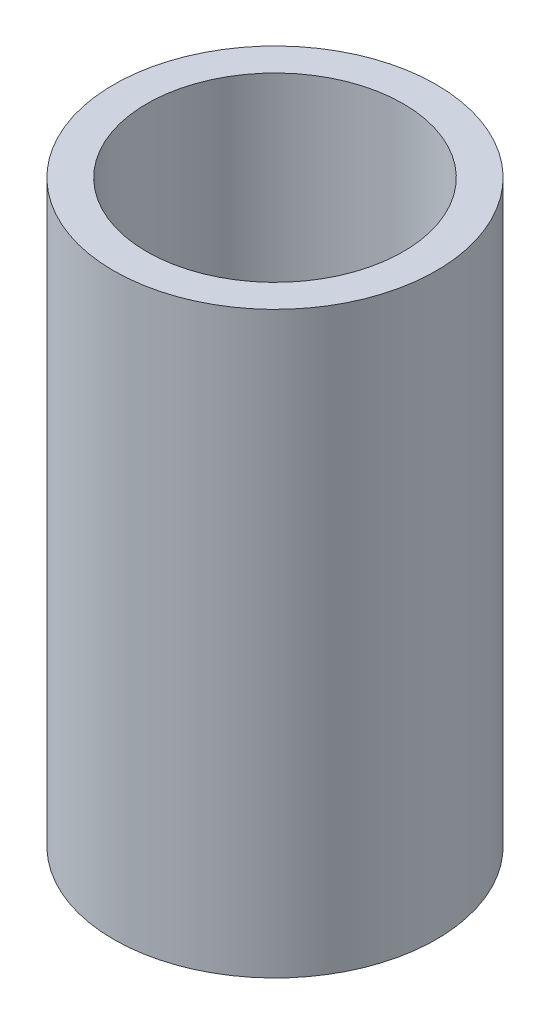
ISO-10303-21;
HEADER;
FILE_DESCRIPTION(('STEP AP214'),'2;1');
FILE_NAME('part.step','',(''),(''),'','','');
FILE_SCHEMA(('AUTOMOTIVE_DESIGN { 1 0 10303 214 1 1 1 1 }'));
ENDSEC;
DATA;
#1=APPLICATION_CONTEXT('core data for automotive mechanical design processes');
#2=APPLICATION_PROTOCOL_DEFINITION('international standard','automotive_design',2000,#1);
#3=PRODUCT_CONTEXT('',#1,'mechanical');
#4=PRODUCT('Part','Part','',(#3));
#5=PRODUCT_RELATED_PRODUCT_CATEGORY('part','',(#4));
#6=PRODUCT_DEFINITION_FORMATION('','',#4);
#7=PRODUCT_DEFINITION_CONTEXT('part definition',#1,'design');
#8=PRODUCT_DEFINITION('design','',#6,#7);
#9=PRODUCT_DEFINITION_SHAPE('','',#8);
#10=(LENGTH_UNIT() NAMED_UNIT(*) SI_UNIT(.MILLI.,.METRE.));
#11=(NAMED_UNIT(*) PLANE_ANGLE_UNIT() SI_UNIT($,.RADIAN.));
#12=(NAMED_UNIT(*) SI_UNIT($,.STERADIAN.) SOLID_ANGLE_UNIT());
#13=UNCERTAINTY_MEASURE_WITH_UNIT(LENGTH_MEASURE(1.E-05),#10,'distance_accuracy_value','');
#14=(GEOMETRIC_REPRESENTATION_CONTEXT(3) GLOBAL_UNCERTAINTY_ASSIGNED_CONTEXT((#13)) GLOBAL_UNIT_ASSIGNED_CONTEXT((#10,
#11,#12)) REPRESENTATION_CONTEXT('',''));
#15=CARTESIAN_POINT('',(0.,0.,0.));
#16=DIRECTION('',(0.,0.,1.));
#17=DIRECTION('',(1.,0.,0.));
#18=AXIS2_PLACEMENT_3D('',#15,#16,#17);
#19=CARTESIAN_POINT('',(0.,35.,0.));
#20=DIRECTION('',(0.,1.,0.));
#21=DIRECTION('',(0.,0.,1.));
#22=AXIS2_PLACEMENT_3D('',#19,#20,#21);
#23=PLANE('',#22);
#24=CARTESIAN_POINT('',(0.,35.,0.));
#25=DIRECTION('',(0.,1.,0.));
#26=DIRECTION('',(0.,0.,1.));
#27=AXIS2_PLACEMENT_3D('',#24,#25,#26);
#28=CIRCLE('',#27,9.75);
#29=CARTESIAN_POINT('',(0.,35.,9.75));
#30=VERTEX_POINT('',#29);
#31=EDGE_CURVE('E10',#30,#30,#28,.T.);
#32=ORIENTED_EDGE('',*,*,#31,.T.);
#33=EDGE_LOOP('',(#32));
#34=FACE_BOUND('',#33,.T.);
#35=CARTESIAN_POINT('',(0.,35.,0.));
#36=DIRECTION('',(0.,1.,0.));
#37=DIRECTION('',(0.,0.,1.));
#38=AXIS2_PLACEMENT_3D('',#35,#36,#37);
#39=CIRCLE('',#38,7.75);
#40=CARTESIAN_POINT('',(0.,35.,7.75));
#41=VERTEX_POINT('',#40);
#42=EDGE_CURVE('E44',#41,#41,#39,.T.);
#43=ORIENTED_EDGE('',*,*,#42,.F.);
#44=EDGE_LOOP('',(#43));
#45=FACE_BOUND('',#44,.T.);
#46=ADVANCED_FACE('F33',(#34,#45),#23,.T.);
#47=CARTESIAN_POINT('',(0.,0.,0.));
#48=DIRECTION('',(0.,1.,0.));
#49=DIRECTION('',(0.,0.,1.));
#50=AXIS2_PLACEMENT_3D('',#47,#48,#49);
#51=PLANE('',#50);
#52=CARTESIAN_POINT('',(0.,0.,0.));
#53=DIRECTION('',(0.,1.,0.));
#54=DIRECTION('',(0.,0.,1.));
#55=AXIS2_PLACEMENT_3D('',#52,#53,#54);
#56=CIRCLE('',#55,9.75);
#57=CARTESIAN_POINT('',(0.,0.,9.75));
#58=VERTEX_POINT('',#57);
#59=EDGE_CURVE('E37',#58,#58,#56,.T.);
#60=ORIENTED_EDGE('',*,*,#59,.F.);
#61=EDGE_LOOP('',(#60));
#62=FACE_BOUND('',#61,.T.);
#63=CARTESIAN_POINT('',(0.,0.,0.));
#64=DIRECTION('',(0.,1.,0.));
#65=DIRECTION('',(0.,0.,1.));
#66=AXIS2_PLACEMENT_3D('',#63,#64,#65);
#67=CIRCLE('',#66,7.75);
#68=CARTESIAN_POINT('',(0.,0.,7.75));
#69=VERTEX_POINT('',#68);
#70=EDGE_CURVE('E46',#69,#69,#67,.T.);
#71=ORIENTED_EDGE('',*,*,#70,.T.);
#72=EDGE_LOOP('',(#71));
#73=FACE_BOUND('',#72,.T.);
#74=ADVANCED_FACE('F56',(#62,#73),#51,.F.);
#75=CARTESIAN_POINT('',(0.,35.,0.));
#76=DIRECTION('',(0.,-1.,0.));
#77=DIRECTION('',(0.,0.,-1.));
#78=AXIS2_PLACEMENT_3D('',#75,#76,#77);
#79=CYLINDRICAL_SURFACE('',#78,9.75);
#80=ORIENTED_EDGE('',*,*,#31,.F.);
#81=EDGE_LOOP('',(#80));
#82=FACE_BOUND('',#81,.T.);
#83=ORIENTED_EDGE('',*,*,#59,.T.);
#84=EDGE_LOOP('',(#83));
#85=FACE_BOUND('',#84,.T.);
#86=ADVANCED_FACE('F35',(#82,#85),#79,.T.);
#87=CARTESIAN_POINT('',(0.,35.,0.));
#88=DIRECTION('',(0.,-1.,0.));
#89=DIRECTION('',(0.,0.,-1.));
#90=AXIS2_PLACEMENT_3D('',#87,#88,#89);
#91=CYLINDRICAL_SURFACE('',#90,7.75);
#92=ORIENTED_EDGE('',*,*,#42,.T.);
#93=EDGE_LOOP('',(#92));
#94=FACE_BOUND('',#93,.T.);
#95=ORIENTED_EDGE('',*,*,#70,.F.);
#96=EDGE_LOOP('',(#95));
#97=FACE_BOUND('',#96,.T.);
#98=ADVANCED_FACE('F52',(#94,#97),#91,.F.);
#99=CLOSED_SHELL('',(#46,#74,#86,#98));
#100=MANIFOLD_SOLID_BREP('B2',#99);
#101=ADVANCED_BREP_SHAPE_REPRESENTATION('',(#18,#100),#14);
#102=SHAPE_DEFINITION_REPRESENTATION(#9,#101);
ENDSEC;
END-ISO-10303-21;
